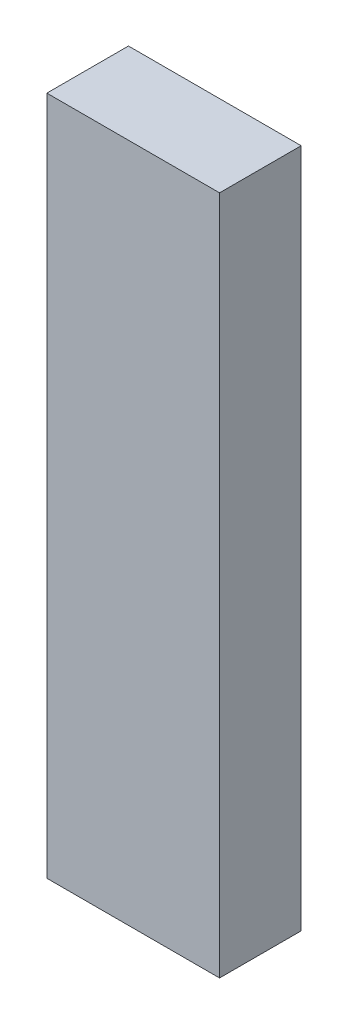
ISO-10303-21;
HEADER;
FILE_DESCRIPTION(('STEP AP214'),'2;1');
FILE_NAME('part.step','',(''),(''),'','','');
FILE_SCHEMA(('AUTOMOTIVE_DESIGN { 1 0 10303 214 1 1 1 1 }'));
ENDSEC;
DATA;
#1=APPLICATION_CONTEXT('core data for automotive mechanical design processes');
#2=APPLICATION_PROTOCOL_DEFINITION('international standard','automotive_design',2000,#1);
#3=PRODUCT_CONTEXT('',#1,'mechanical');
#4=PRODUCT('Part','Part','',(#3));
#5=PRODUCT_RELATED_PRODUCT_CATEGORY('part','',(#4));
#6=PRODUCT_DEFINITION_FORMATION('','',#4);
#7=PRODUCT_DEFINITION_CONTEXT('part definition',#1,'design');
#8=PRODUCT_DEFINITION('design','',#6,#7);
#9=PRODUCT_DEFINITION_SHAPE('','',#8);
#10=(LENGTH_UNIT() NAMED_UNIT(*) SI_UNIT(.MILLI.,.METRE.));
#11=(NAMED_UNIT(*) PLANE_ANGLE_UNIT() SI_UNIT($,.RADIAN.));
#12=(NAMED_UNIT(*) SI_UNIT($,.STERADIAN.) SOLID_ANGLE_UNIT());
#13=UNCERTAINTY_MEASURE_WITH_UNIT(LENGTH_MEASURE(1.E-05),#10,'distance_accuracy_value','');
#14=(GEOMETRIC_REPRESENTATION_CONTEXT(3) GLOBAL_UNCERTAINTY_ASSIGNED_CONTEXT((#13)) GLOBAL_UNIT_ASSIGNED_CONTEXT((#10,
#11,#12)) REPRESENTATION_CONTEXT('',''));
#15=CARTESIAN_POINT('',(0.,0.,0.));
#16=DIRECTION('',(0.,0.,1.));
#17=DIRECTION('',(1.,0.,0.));
#18=AXIS2_PLACEMENT_3D('',#15,#16,#17);
#19=CARTESIAN_POINT('',(3.175,-12.5,3.));
#20=DIRECTION('',(-1.,0.,0.));
#21=DIRECTION('',(0.,0.,1.));
#22=AXIS2_PLACEMENT_3D('',#19,#20,#21);
#23=PLANE('',#22);
#24=DIRECTION('',(0.,1.,0.));
#25=VECTOR('',#24,1.);
#26=CARTESIAN_POINT('',(3.175,-12.5,0.));
#27=LINE('',#26,#25);
#28=CARTESIAN_POINT('',(3.175,-12.5,0.));
#29=VERTEX_POINT('',#28);
#30=CARTESIAN_POINT('',(3.175,12.5,0.));
#31=VERTEX_POINT('',#30);
#32=EDGE_CURVE('E113',#29,#31,#27,.T.);
#33=ORIENTED_EDGE('',*,*,#32,.T.);
#34=DIRECTION('',(0.,0.,-1.));
#35=VECTOR('',#34,1.);
#36=CARTESIAN_POINT('',(3.175,12.5,3.));
#37=LINE('',#36,#35);
#38=CARTESIAN_POINT('',(3.175,12.5,3.));
#39=VERTEX_POINT('',#38);
#40=EDGE_CURVE('E11',#39,#31,#37,.T.);
#41=ORIENTED_EDGE('',*,*,#40,.F.);
#42=DIRECTION('',(0.,1.,0.));
#43=VECTOR('',#42,1.);
#44=CARTESIAN_POINT('',(3.175,-12.5,3.));
#45=LINE('',#44,#43);
#46=CARTESIAN_POINT('',(3.175,-12.5,3.));
#47=VERTEX_POINT('',#46);
#48=EDGE_CURVE('E97',#47,#39,#45,.T.);
#49=ORIENTED_EDGE('',*,*,#48,.F.);
#50=DIRECTION('',(0.,0.,-1.));
#51=VECTOR('',#50,1.);
#52=CARTESIAN_POINT('',(3.175,-12.5,3.));
#53=LINE('',#52,#51);
#54=EDGE_CURVE('E109',#47,#29,#53,.T.);
#55=ORIENTED_EDGE('',*,*,#54,.T.);
#56=EDGE_LOOP('',(#33,#41,#49,#55));
#57=FACE_BOUND('',#56,.T.);
#58=ADVANCED_FACE('F45',(#57),#23,.F.);
#59=CARTESIAN_POINT('',(-3.175,12.5,3.));
#60=DIRECTION('',(0.,-1.,0.));
#61=DIRECTION('',(0.,0.,-1.));
#62=AXIS2_PLACEMENT_3D('',#59,#60,#61);
#63=PLANE('',#62);
#64=DIRECTION('',(-1.,0.,0.));
#65=VECTOR('',#64,1.);
#66=CARTESIAN_POINT('',(-3.175,12.5,0.));
#67=LINE('',#66,#65);
#68=CARTESIAN_POINT('',(-3.175,12.5,0.));
#69=VERTEX_POINT('',#68);
#70=EDGE_CURVE('E102',#31,#69,#67,.T.);
#71=ORIENTED_EDGE('',*,*,#70,.T.);
#72=DIRECTION('',(0.,0.,-1.));
#73=VECTOR('',#72,1.);
#74=CARTESIAN_POINT('',(-3.175,12.5,3.));
#75=LINE('',#74,#73);
#76=CARTESIAN_POINT('',(-3.175,12.5,3.));
#77=VERTEX_POINT('',#76);
#78=EDGE_CURVE('E54',#77,#69,#75,.T.);
#79=ORIENTED_EDGE('',*,*,#78,.F.);
#80=DIRECTION('',(-1.,0.,0.));
#81=VECTOR('',#80,1.);
#82=CARTESIAN_POINT('',(-3.175,12.5,3.));
#83=LINE('',#82,#81);
#84=EDGE_CURVE('E92',#39,#77,#83,.T.);
#85=ORIENTED_EDGE('',*,*,#84,.F.);
#86=ORIENTED_EDGE('',*,*,#40,.T.);
#87=EDGE_LOOP('',(#71,#79,#85,#86));
#88=FACE_BOUND('',#87,.T.);
#89=ADVANCED_FACE('F101',(#88),#63,.F.);
#90=CARTESIAN_POINT('',(-3.175,-12.5,3.));
#91=DIRECTION('',(1.,0.,0.));
#92=DIRECTION('',(0.,0.,-1.));
#93=AXIS2_PLACEMENT_3D('',#90,#91,#92);
#94=PLANE('',#93);
#95=DIRECTION('',(0.,-1.,0.));
#96=VECTOR('',#95,1.);
#97=CARTESIAN_POINT('',(-3.175,-12.5,0.));
#98=LINE('',#97,#96);
#99=CARTESIAN_POINT('',(-3.175,-12.5,0.));
#100=VERTEX_POINT('',#99);
#101=EDGE_CURVE('E79',#69,#100,#98,.T.);
#102=ORIENTED_EDGE('',*,*,#101,.T.);
#103=DIRECTION('',(0.,0.,-1.));
#104=VECTOR('',#103,1.);
#105=CARTESIAN_POINT('',(-3.175,-12.5,3.));
#106=LINE('',#105,#104);
#107=CARTESIAN_POINT('',(-3.175,-12.5,3.));
#108=VERTEX_POINT('',#107);
#109=EDGE_CURVE('E104',#108,#100,#106,.T.);
#110=ORIENTED_EDGE('',*,*,#109,.F.);
#111=DIRECTION('',(0.,-1.,0.));
#112=VECTOR('',#111,1.);
#113=CARTESIAN_POINT('',(-3.175,-12.5,3.));
#114=LINE('',#113,#112);
#115=EDGE_CURVE('E95',#77,#108,#114,.T.);
#116=ORIENTED_EDGE('',*,*,#115,.F.);
#117=ORIENTED_EDGE('',*,*,#78,.T.);
#118=EDGE_LOOP('',(#102,#110,#116,#117));
#119=FACE_BOUND('',#118,.T.);
#120=ADVANCED_FACE('F105',(#119),#94,.F.);
#121=CARTESIAN_POINT('',(-3.175,-12.5,3.));
#122=DIRECTION('',(0.,1.,0.));
#123=DIRECTION('',(0.,0.,1.));
#124=AXIS2_PLACEMENT_3D('',#121,#122,#123);
#125=PLANE('',#124);
#126=DIRECTION('',(1.,0.,0.));
#127=VECTOR('',#126,1.);
#128=CARTESIAN_POINT('',(-3.175,-12.5,0.));
#129=LINE('',#128,#127);
#130=EDGE_CURVE('E85',#100,#29,#129,.T.);
#131=ORIENTED_EDGE('',*,*,#130,.T.);
#132=ORIENTED_EDGE('',*,*,#54,.F.);
#133=DIRECTION('',(1.,0.,0.));
#134=VECTOR('',#133,1.);
#135=CARTESIAN_POINT('',(-3.175,-12.5,3.));
#136=LINE('',#135,#134);
#137=EDGE_CURVE('E62',#108,#47,#136,.T.);
#138=ORIENTED_EDGE('',*,*,#137,.F.);
#139=ORIENTED_EDGE('',*,*,#109,.T.);
#140=EDGE_LOOP('',(#131,#132,#138,#139));
#141=FACE_BOUND('',#140,.T.);
#142=ADVANCED_FACE('F126',(#141),#125,.F.);
#143=CARTESIAN_POINT('',(0.,0.,3.));
#144=DIRECTION('',(0.,0.,-1.));
#145=DIRECTION('',(-1.,0.,0.));
#146=AXIS2_PLACEMENT_3D('',#143,#144,#145);
#147=PLANE('',#146);
#148=ORIENTED_EDGE('',*,*,#48,.T.);
#149=ORIENTED_EDGE('',*,*,#84,.T.);
#150=ORIENTED_EDGE('',*,*,#115,.T.);
#151=ORIENTED_EDGE('',*,*,#137,.T.);
#152=EDGE_LOOP('',(#148,#149,#150,#151));
#153=FACE_BOUND('',#152,.T.);
#154=ADVANCED_FACE('F93',(#153),#147,.F.);
#155=CARTESIAN_POINT('',(0.,0.,0.));
#156=DIRECTION('',(0.,0.,-1.));
#157=DIRECTION('',(-1.,0.,0.));
#158=AXIS2_PLACEMENT_3D('',#155,#156,#157);
#159=PLANE('',#158);
#160=ORIENTED_EDGE('',*,*,#32,.F.);
#161=ORIENTED_EDGE('',*,*,#130,.F.);
#162=ORIENTED_EDGE('',*,*,#101,.F.);
#163=ORIENTED_EDGE('',*,*,#70,.F.);
#164=EDGE_LOOP('',(#160,#161,#162,#163));
#165=FACE_BOUND('',#164,.T.);
#166=ADVANCED_FACE('F129',(#165),#159,.T.);
#167=CLOSED_SHELL('',(#58,#89,#120,#142,#154,#166));
#168=MANIFOLD_SOLID_BREP('B2',#167);
#169=ADVANCED_BREP_SHAPE_REPRESENTATION('',(#18,#168),#14);
#170=SHAPE_DEFINITION_REPRESENTATION(#9,#169);
ENDSEC;
END-ISO-10303-21;
